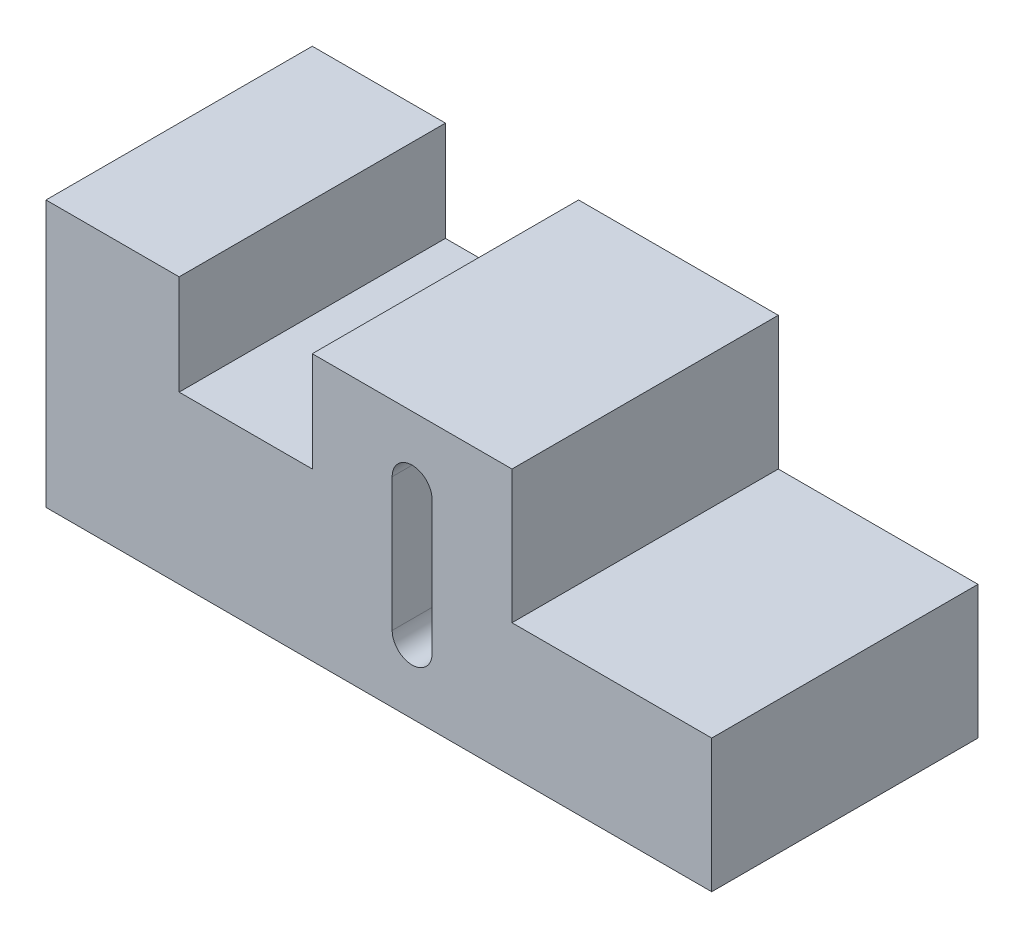
ISO-10303-21;
HEADER;
FILE_DESCRIPTION(('STEP AP214'),'2;1');
FILE_NAME('part.step','',(''),(''),'','','');
FILE_SCHEMA(('AUTOMOTIVE_DESIGN { 1 0 10303 214 1 1 1 1 }'));
ENDSEC;
DATA;
#1=APPLICATION_CONTEXT('core data for automotive mechanical design processes');
#2=APPLICATION_PROTOCOL_DEFINITION('international standard','automotive_design',2000,#1);
#3=PRODUCT_CONTEXT('',#1,'mechanical');
#4=PRODUCT('Part','Part','',(#3));
#5=PRODUCT_RELATED_PRODUCT_CATEGORY('part','',(#4));
#6=PRODUCT_DEFINITION_FORMATION('','',#4);
#7=PRODUCT_DEFINITION_CONTEXT('part definition',#1,'design');
#8=PRODUCT_DEFINITION('design','',#6,#7);
#9=PRODUCT_DEFINITION_SHAPE('','',#8);
#10=(LENGTH_UNIT() NAMED_UNIT(*) SI_UNIT(.MILLI.,.METRE.));
#11=(NAMED_UNIT(*) PLANE_ANGLE_UNIT() SI_UNIT($,.RADIAN.));
#12=(NAMED_UNIT(*) SI_UNIT($,.STERADIAN.) SOLID_ANGLE_UNIT());
#13=UNCERTAINTY_MEASURE_WITH_UNIT(LENGTH_MEASURE(1.E-05),#10,'distance_accuracy_value','');
#14=(GEOMETRIC_REPRESENTATION_CONTEXT(3) GLOBAL_UNCERTAINTY_ASSIGNED_CONTEXT((#13)) GLOBAL_UNIT_ASSIGNED_CONTEXT((#10,
#11,#12)) REPRESENTATION_CONTEXT('',''));
#15=CARTESIAN_POINT('',(0.,0.,0.));
#16=DIRECTION('',(0.,0.,1.));
#17=DIRECTION('',(1.,0.,0.));
#18=AXIS2_PLACEMENT_3D('',#15,#16,#17);
#19=CARTESIAN_POINT('',(12.7,15.875,-25.4));
#20=DIRECTION('',(1.,0.,0.));
#21=DIRECTION('',(0.,0.,-1.));
#22=AXIS2_PLACEMENT_3D('',#19,#20,#21);
#23=PLANE('',#22);
#24=DIRECTION('',(0.,1.,0.));
#25=VECTOR('',#24,1.);
#26=CARTESIAN_POINT('',(12.7,15.875,0.));
#27=LINE('',#26,#25);
#28=CARTESIAN_POINT('',(12.7,15.875,0.));
#29=VERTEX_POINT('',#28);
#30=CARTESIAN_POINT('',(12.7,25.4,0.));
#31=VERTEX_POINT('',#30);
#32=EDGE_CURVE('E165',#29,#31,#27,.T.);
#33=ORIENTED_EDGE('',*,*,#32,.F.);
#34=DIRECTION('',(0.,0.,1.));
#35=VECTOR('',#34,1.);
#36=CARTESIAN_POINT('',(12.7,15.875,-25.4));
#37=LINE('',#36,#35);
#38=CARTESIAN_POINT('',(12.7,15.875,-25.4));
#39=VERTEX_POINT('',#38);
#40=EDGE_CURVE('E11',#39,#29,#37,.T.);
#41=ORIENTED_EDGE('',*,*,#40,.F.);
#42=DIRECTION('',(0.,1.,0.));
#43=VECTOR('',#42,1.);
#44=CARTESIAN_POINT('',(12.7,15.875,-25.4));
#45=LINE('',#44,#43);
#46=CARTESIAN_POINT('',(12.7,25.4,-25.4));
#47=VERTEX_POINT('',#46);
#48=EDGE_CURVE('E169',#39,#47,#45,.T.);
#49=ORIENTED_EDGE('',*,*,#48,.T.);
#50=DIRECTION('',(0.,0.,1.));
#51=VECTOR('',#50,1.);
#52=CARTESIAN_POINT('',(12.7,25.4,-25.4));
#53=LINE('',#52,#51);
#54=EDGE_CURVE('E34',#47,#31,#53,.T.);
#55=ORIENTED_EDGE('',*,*,#54,.T.);
#56=EDGE_LOOP('',(#33,#41,#49,#55));
#57=FACE_BOUND('',#56,.T.);
#58=ADVANCED_FACE('F31',(#57),#23,.T.);
#59=CARTESIAN_POINT('',(25.4,15.875,-25.4));
#60=DIRECTION('',(0.,1.,0.));
#61=DIRECTION('',(-1.,0.,0.));
#62=AXIS2_PLACEMENT_3D('',#59,#60,#61);
#63=PLANE('',#62);
#64=DIRECTION('',(-1.,0.,0.));
#65=VECTOR('',#64,1.);
#66=CARTESIAN_POINT('',(25.4,15.875,0.));
#67=LINE('',#66,#65);
#68=CARTESIAN_POINT('',(25.4,15.875,0.));
#69=VERTEX_POINT('',#68);
#70=EDGE_CURVE('E173',#69,#29,#67,.T.);
#71=ORIENTED_EDGE('',*,*,#70,.F.);
#72=DIRECTION('',(0.,0.,1.));
#73=VECTOR('',#72,1.);
#74=CARTESIAN_POINT('',(25.4,15.875,-25.4));
#75=LINE('',#74,#73);
#76=CARTESIAN_POINT('',(25.4,15.875,-25.4));
#77=VERTEX_POINT('',#76);
#78=EDGE_CURVE('E39',#77,#69,#75,.T.);
#79=ORIENTED_EDGE('',*,*,#78,.F.);
#80=DIRECTION('',(-1.,0.,0.));
#81=VECTOR('',#80,1.);
#82=CARTESIAN_POINT('',(25.4,15.875,-25.4));
#83=LINE('',#82,#81);
#84=EDGE_CURVE('E197',#77,#39,#83,.T.);
#85=ORIENTED_EDGE('',*,*,#84,.T.);
#86=ORIENTED_EDGE('',*,*,#40,.T.);
#87=EDGE_LOOP('',(#71,#79,#85,#86));
#88=FACE_BOUND('',#87,.T.);
#89=ADVANCED_FACE('F254',(#88),#63,.T.);
#90=CARTESIAN_POINT('',(25.4,25.4,-25.4));
#91=DIRECTION('',(-1.,0.,0.));
#92=DIRECTION('',(0.,0.,1.));
#93=AXIS2_PLACEMENT_3D('',#90,#91,#92);
#94=PLANE('',#93);
#95=DIRECTION('',(0.,-1.,0.));
#96=VECTOR('',#95,1.);
#97=CARTESIAN_POINT('',(25.4,25.4,0.));
#98=LINE('',#97,#96);
#99=CARTESIAN_POINT('',(25.4,25.4,0.));
#100=VERTEX_POINT('',#99);
#101=EDGE_CURVE('E223',#100,#69,#98,.T.);
#102=ORIENTED_EDGE('',*,*,#101,.F.);
#103=DIRECTION('',(0.,0.,1.));
#104=VECTOR('',#103,1.);
#105=CARTESIAN_POINT('',(25.4,25.4,-25.4));
#106=LINE('',#105,#104);
#107=CARTESIAN_POINT('',(25.4,25.4,-25.4));
#108=VERTEX_POINT('',#107);
#109=EDGE_CURVE('E229',#108,#100,#106,.T.);
#110=ORIENTED_EDGE('',*,*,#109,.F.);
#111=DIRECTION('',(0.,-1.,0.));
#112=VECTOR('',#111,1.);
#113=CARTESIAN_POINT('',(25.4,25.4,-25.4));
#114=LINE('',#113,#112);
#115=EDGE_CURVE('E194',#108,#77,#114,.T.);
#116=ORIENTED_EDGE('',*,*,#115,.T.);
#117=ORIENTED_EDGE('',*,*,#78,.T.);
#118=EDGE_LOOP('',(#102,#110,#116,#117));
#119=FACE_BOUND('',#118,.T.);
#120=ADVANCED_FACE('F281',(#119),#94,.T.);
#121=CARTESIAN_POINT('',(44.45,25.4,-25.4));
#122=DIRECTION('',(0.,1.,0.));
#123=DIRECTION('',(-1.,0.,0.));
#124=AXIS2_PLACEMENT_3D('',#121,#122,#123);
#125=PLANE('',#124);
#126=DIRECTION('',(-1.,0.,0.));
#127=VECTOR('',#126,1.);
#128=CARTESIAN_POINT('',(44.45,25.4,0.));
#129=LINE('',#128,#127);
#130=CARTESIAN_POINT('',(44.45,25.4,0.));
#131=VERTEX_POINT('',#130);
#132=EDGE_CURVE('E220',#131,#100,#129,.T.);
#133=ORIENTED_EDGE('',*,*,#132,.F.);
#134=DIRECTION('',(0.,0.,1.));
#135=VECTOR('',#134,1.);
#136=CARTESIAN_POINT('',(44.45,25.4,-25.4));
#137=LINE('',#136,#135);
#138=CARTESIAN_POINT('',(44.45,25.4,-25.4));
#139=VERTEX_POINT('',#138);
#140=EDGE_CURVE('E231',#139,#131,#137,.T.);
#141=ORIENTED_EDGE('',*,*,#140,.F.);
#142=DIRECTION('',(-1.,0.,0.));
#143=VECTOR('',#142,1.);
#144=CARTESIAN_POINT('',(44.45,25.4,-25.4));
#145=LINE('',#144,#143);
#146=EDGE_CURVE('E191',#139,#108,#145,.T.);
#147=ORIENTED_EDGE('',*,*,#146,.T.);
#148=ORIENTED_EDGE('',*,*,#109,.T.);
#149=EDGE_LOOP('',(#133,#141,#147,#148));
#150=FACE_BOUND('',#149,.T.);
#151=ADVANCED_FACE('F279',(#150),#125,.T.);
#152=CARTESIAN_POINT('',(44.45,12.7,-25.4));
#153=DIRECTION('',(1.,0.,0.));
#154=DIRECTION('',(0.,1.,0.));
#155=AXIS2_PLACEMENT_3D('',#152,#153,#154);
#156=PLANE('',#155);
#157=DIRECTION('',(0.,1.,0.));
#158=VECTOR('',#157,1.);
#159=CARTESIAN_POINT('',(44.45,12.7,0.));
#160=LINE('',#159,#158);
#161=CARTESIAN_POINT('',(44.45,12.7,0.));
#162=VERTEX_POINT('',#161);
#163=EDGE_CURVE('E217',#162,#131,#160,.T.);
#164=ORIENTED_EDGE('',*,*,#163,.F.);
#165=DIRECTION('',(0.,0.,1.));
#166=VECTOR('',#165,1.);
#167=CARTESIAN_POINT('',(44.45,12.7,-25.4));
#168=LINE('',#167,#166);
#169=CARTESIAN_POINT('',(44.45,12.7,-25.4));
#170=VERTEX_POINT('',#169);
#171=EDGE_CURVE('E233',#170,#162,#168,.T.);
#172=ORIENTED_EDGE('',*,*,#171,.F.);
#173=DIRECTION('',(0.,1.,0.));
#174=VECTOR('',#173,1.);
#175=CARTESIAN_POINT('',(44.45,12.7,-25.4));
#176=LINE('',#175,#174);
#177=EDGE_CURVE('E188',#170,#139,#176,.T.);
#178=ORIENTED_EDGE('',*,*,#177,.T.);
#179=ORIENTED_EDGE('',*,*,#140,.T.);
#180=EDGE_LOOP('',(#164,#172,#178,#179));
#181=FACE_BOUND('',#180,.T.);
#182=ADVANCED_FACE('F275',(#181),#156,.T.);
#183=CARTESIAN_POINT('',(63.5,12.7,-25.4));
#184=DIRECTION('',(0.,1.,0.));
#185=DIRECTION('',(-1.,0.,0.));
#186=AXIS2_PLACEMENT_3D('',#183,#184,#185);
#187=PLANE('',#186);
#188=DIRECTION('',(-1.,0.,0.));
#189=VECTOR('',#188,1.);
#190=CARTESIAN_POINT('',(63.5,12.7,0.));
#191=LINE('',#190,#189);
#192=CARTESIAN_POINT('',(63.5,12.7,0.));
#193=VERTEX_POINT('',#192);
#194=EDGE_CURVE('E214',#193,#162,#191,.T.);
#195=ORIENTED_EDGE('',*,*,#194,.F.);
#196=DIRECTION('',(0.,0.,1.));
#197=VECTOR('',#196,1.);
#198=CARTESIAN_POINT('',(63.5,12.7,-25.4));
#199=LINE('',#198,#197);
#200=CARTESIAN_POINT('',(63.5,12.7,-25.4));
#201=VERTEX_POINT('',#200);
#202=EDGE_CURVE('E235',#201,#193,#199,.T.);
#203=ORIENTED_EDGE('',*,*,#202,.F.);
#204=DIRECTION('',(-1.,0.,0.));
#205=VECTOR('',#204,1.);
#206=CARTESIAN_POINT('',(63.5,12.7,-25.4));
#207=LINE('',#206,#205);
#208=EDGE_CURVE('E185',#201,#170,#207,.T.);
#209=ORIENTED_EDGE('',*,*,#208,.T.);
#210=ORIENTED_EDGE('',*,*,#171,.T.);
#211=EDGE_LOOP('',(#195,#203,#209,#210));
#212=FACE_BOUND('',#211,.T.);
#213=ADVANCED_FACE('F271',(#212),#187,.T.);
#214=CARTESIAN_POINT('',(63.5,0.,-25.4));
#215=DIRECTION('',(1.,0.,0.));
#216=DIRECTION('',(0.,1.,0.));
#217=AXIS2_PLACEMENT_3D('',#214,#215,#216);
#218=PLANE('',#217);
#219=DIRECTION('',(0.,1.,0.));
#220=VECTOR('',#219,1.);
#221=CARTESIAN_POINT('',(63.5,0.,0.));
#222=LINE('',#221,#220);
#223=CARTESIAN_POINT('',(63.5,0.,0.));
#224=VERTEX_POINT('',#223);
#225=EDGE_CURVE('E211',#224,#193,#222,.T.);
#226=ORIENTED_EDGE('',*,*,#225,.F.);
#227=DIRECTION('',(0.,0.,1.));
#228=VECTOR('',#227,1.);
#229=CARTESIAN_POINT('',(63.5,0.,-25.4));
#230=LINE('',#229,#228);
#231=CARTESIAN_POINT('',(63.5,0.,-25.4));
#232=VERTEX_POINT('',#231);
#233=EDGE_CURVE('E237',#232,#224,#230,.T.);
#234=ORIENTED_EDGE('',*,*,#233,.F.);
#235=DIRECTION('',(0.,1.,0.));
#236=VECTOR('',#235,1.);
#237=CARTESIAN_POINT('',(63.5,0.,-25.4));
#238=LINE('',#237,#236);
#239=EDGE_CURVE('E182',#232,#201,#238,.T.);
#240=ORIENTED_EDGE('',*,*,#239,.T.);
#241=ORIENTED_EDGE('',*,*,#202,.T.);
#242=EDGE_LOOP('',(#226,#234,#240,#241));
#243=FACE_BOUND('',#242,.T.);
#244=ADVANCED_FACE('F267',(#243),#218,.T.);
#245=CARTESIAN_POINT('',(0.,0.,-25.4));
#246=DIRECTION('',(0.,-1.,0.));
#247=DIRECTION('',(0.,0.,-1.));
#248=AXIS2_PLACEMENT_3D('',#245,#246,#247);
#249=PLANE('',#248);
#250=DIRECTION('',(1.,0.,0.));
#251=VECTOR('',#250,1.);
#252=CARTESIAN_POINT('',(0.,0.,0.));
#253=LINE('',#252,#251);
#254=CARTESIAN_POINT('',(0.,0.,0.));
#255=VERTEX_POINT('',#254);
#256=EDGE_CURVE('E208',#255,#224,#253,.T.);
#257=ORIENTED_EDGE('',*,*,#256,.F.);
#258=DIRECTION('',(0.,0.,1.));
#259=VECTOR('',#258,1.);
#260=CARTESIAN_POINT('',(0.,0.,-25.4));
#261=LINE('',#260,#259);
#262=CARTESIAN_POINT('',(0.,0.,-25.4));
#263=VERTEX_POINT('',#262);
#264=EDGE_CURVE('E239',#263,#255,#261,.T.);
#265=ORIENTED_EDGE('',*,*,#264,.F.);
#266=DIRECTION('',(1.,0.,0.));
#267=VECTOR('',#266,1.);
#268=CARTESIAN_POINT('',(0.,0.,-25.4));
#269=LINE('',#268,#267);
#270=EDGE_CURVE('E179',#263,#232,#269,.T.);
#271=ORIENTED_EDGE('',*,*,#270,.T.);
#272=ORIENTED_EDGE('',*,*,#233,.T.);
#273=EDGE_LOOP('',(#257,#265,#271,#272));
#274=FACE_BOUND('',#273,.T.);
#275=ADVANCED_FACE('F265',(#274),#249,.T.);
#276=CARTESIAN_POINT('',(0.,25.4,-25.4));
#277=DIRECTION('',(-1.,0.,0.));
#278=DIRECTION('',(0.,-1.,0.));
#279=AXIS2_PLACEMENT_3D('',#276,#277,#278);
#280=PLANE('',#279);
#281=DIRECTION('',(0.,-1.,0.));
#282=VECTOR('',#281,1.);
#283=CARTESIAN_POINT('',(0.,25.4,0.));
#284=LINE('',#283,#282);
#285=CARTESIAN_POINT('',(0.,25.4,0.));
#286=VERTEX_POINT('',#285);
#287=EDGE_CURVE('E205',#286,#255,#284,.T.);
#288=ORIENTED_EDGE('',*,*,#287,.F.);
#289=DIRECTION('',(0.,0.,1.));
#290=VECTOR('',#289,1.);
#291=CARTESIAN_POINT('',(0.,25.4,-25.4));
#292=LINE('',#291,#290);
#293=CARTESIAN_POINT('',(0.,25.4,-25.4));
#294=VERTEX_POINT('',#293);
#295=EDGE_CURVE('E240',#294,#286,#292,.T.);
#296=ORIENTED_EDGE('',*,*,#295,.F.);
#297=DIRECTION('',(0.,-1.,0.));
#298=VECTOR('',#297,1.);
#299=CARTESIAN_POINT('',(0.,25.4,-25.4));
#300=LINE('',#299,#298);
#301=EDGE_CURVE('E176',#294,#263,#300,.T.);
#302=ORIENTED_EDGE('',*,*,#301,.T.);
#303=ORIENTED_EDGE('',*,*,#264,.T.);
#304=EDGE_LOOP('',(#288,#296,#302,#303));
#305=FACE_BOUND('',#304,.T.);
#306=ADVANCED_FACE('F261',(#305),#280,.T.);
#307=CARTESIAN_POINT('',(12.7,25.4,-25.4));
#308=DIRECTION('',(0.,1.,0.));
#309=DIRECTION('',(0.,0.,1.));
#310=AXIS2_PLACEMENT_3D('',#307,#308,#309);
#311=PLANE('',#310);
#312=DIRECTION('',(-1.,0.,0.));
#313=VECTOR('',#312,1.);
#314=CARTESIAN_POINT('',(12.7,25.4,0.));
#315=LINE('',#314,#313);
#316=EDGE_CURVE('E202',#31,#286,#315,.T.);
#317=ORIENTED_EDGE('',*,*,#316,.F.);
#318=ORIENTED_EDGE('',*,*,#54,.F.);
#319=DIRECTION('',(-1.,0.,0.));
#320=VECTOR('',#319,1.);
#321=CARTESIAN_POINT('',(12.7,25.4,-25.4));
#322=LINE('',#321,#320);
#323=EDGE_CURVE('E172',#47,#294,#322,.T.);
#324=ORIENTED_EDGE('',*,*,#323,.T.);
#325=ORIENTED_EDGE('',*,*,#295,.T.);
#326=EDGE_LOOP('',(#317,#318,#324,#325));
#327=FACE_BOUND('',#326,.T.);
#328=ADVANCED_FACE('F248',(#327),#311,.T.);
#329=CARTESIAN_POINT('',(12.7,25.4,-25.4));
#330=DIRECTION('',(0.,0.,1.));
#331=DIRECTION('',(1.,0.,0.));
#332=AXIS2_PLACEMENT_3D('',#329,#330,#331);
#333=PLANE('',#332);
#334=DIRECTION('',(0.,1.,0.));
#335=VECTOR('',#334,1.);
#336=CARTESIAN_POINT('',(36.83,19.05,-25.4));
#337=LINE('',#336,#335);
#338=CARTESIAN_POINT('',(36.83,6.35000000000001,-25.4));
#339=VERTEX_POINT('',#338);
#340=CARTESIAN_POINT('',(36.83,19.05,-25.4));
#341=VERTEX_POINT('',#340);
#342=EDGE_CURVE('E140',#339,#341,#337,.T.);
#343=ORIENTED_EDGE('',*,*,#342,.T.);
#344=CARTESIAN_POINT('',(34.925,19.05,-25.4));
#345=DIRECTION('',(0.,0.,1.));
#346=DIRECTION('',(1.,0.,0.));
#347=AXIS2_PLACEMENT_3D('',#344,#345,#346);
#348=CIRCLE('',#347,1.905);
#349=CARTESIAN_POINT('',(33.02,19.05,-25.4));
#350=VERTEX_POINT('',#349);
#351=EDGE_CURVE('E134',#341,#350,#348,.T.);
#352=ORIENTED_EDGE('',*,*,#351,.T.);
#353=DIRECTION('',(0.,-1.,0.));
#354=VECTOR('',#353,1.);
#355=CARTESIAN_POINT('',(33.02,19.05,-25.4));
#356=LINE('',#355,#354);
#357=CARTESIAN_POINT('',(33.02,6.35000000000001,-25.4));
#358=VERTEX_POINT('',#357);
#359=EDGE_CURVE('E143',#350,#358,#356,.T.);
#360=ORIENTED_EDGE('',*,*,#359,.T.);
#361=CARTESIAN_POINT('',(34.925,6.35000000000001,-25.4));
#362=DIRECTION('',(0.,0.,1.));
#363=DIRECTION('',(1.,0.,0.));
#364=AXIS2_PLACEMENT_3D('',#361,#362,#363);
#365=CIRCLE('',#364,1.905);
#366=EDGE_CURVE('E47',#358,#339,#365,.T.);
#367=ORIENTED_EDGE('',*,*,#366,.T.);
#368=EDGE_LOOP('',(#343,#352,#360,#367));
#369=FACE_BOUND('',#368,.T.);
#370=ORIENTED_EDGE('',*,*,#48,.F.);
#371=ORIENTED_EDGE('',*,*,#84,.F.);
#372=ORIENTED_EDGE('',*,*,#115,.F.);
#373=ORIENTED_EDGE('',*,*,#146,.F.);
#374=ORIENTED_EDGE('',*,*,#177,.F.);
#375=ORIENTED_EDGE('',*,*,#208,.F.);
#376=ORIENTED_EDGE('',*,*,#239,.F.);
#377=ORIENTED_EDGE('',*,*,#270,.F.);
#378=ORIENTED_EDGE('',*,*,#301,.F.);
#379=ORIENTED_EDGE('',*,*,#323,.F.);
#380=EDGE_LOOP('',(#370,#371,#372,#373,#374,#375,#376,#377,#378,#379));
#381=FACE_BOUND('',#380,.T.);
#382=ADVANCED_FACE('F147',(#369,#381),#333,.F.);
#383=CARTESIAN_POINT('',(12.7,25.4,0.));
#384=DIRECTION('',(0.,0.,1.));
#385=DIRECTION('',(1.,0.,0.));
#386=AXIS2_PLACEMENT_3D('',#383,#384,#385);
#387=PLANE('',#386);
#388=CARTESIAN_POINT('',(34.925,19.05,0.));
#389=DIRECTION('',(0.,0.,1.));
#390=DIRECTION('',(1.,0.,0.));
#391=AXIS2_PLACEMENT_3D('',#388,#389,#390);
#392=CIRCLE('',#391,1.905);
#393=CARTESIAN_POINT('',(36.83,19.05,0.));
#394=VERTEX_POINT('',#393);
#395=CARTESIAN_POINT('',(33.02,19.05,0.));
#396=VERTEX_POINT('',#395);
#397=EDGE_CURVE('E55',#394,#396,#392,.T.);
#398=ORIENTED_EDGE('',*,*,#397,.F.);
#399=DIRECTION('',(0.,1.,0.));
#400=VECTOR('',#399,1.);
#401=CARTESIAN_POINT('',(36.83,19.05,0.));
#402=LINE('',#401,#400);
#403=CARTESIAN_POINT('',(36.83,6.35000000000001,0.));
#404=VERTEX_POINT('',#403);
#405=EDGE_CURVE('E150',#404,#394,#402,.T.);
#406=ORIENTED_EDGE('',*,*,#405,.F.);
#407=CARTESIAN_POINT('',(34.925,6.35000000000001,0.));
#408=DIRECTION('',(0.,0.,1.));
#409=DIRECTION('',(1.,0.,0.));
#410=AXIS2_PLACEMENT_3D('',#407,#408,#409);
#411=CIRCLE('',#410,1.905);
#412=CARTESIAN_POINT('',(33.02,6.35000000000001,0.));
#413=VERTEX_POINT('',#412);
#414=EDGE_CURVE('E153',#413,#404,#411,.T.);
#415=ORIENTED_EDGE('',*,*,#414,.F.);
#416=DIRECTION('',(0.,-1.,0.));
#417=VECTOR('',#416,1.);
#418=CARTESIAN_POINT('',(33.02,19.05,0.));
#419=LINE('',#418,#417);
#420=EDGE_CURVE('E159',#396,#413,#419,.T.);
#421=ORIENTED_EDGE('',*,*,#420,.F.);
#422=EDGE_LOOP('',(#398,#406,#415,#421));
#423=FACE_BOUND('',#422,.T.);
#424=ORIENTED_EDGE('',*,*,#32,.T.);
#425=ORIENTED_EDGE('',*,*,#316,.T.);
#426=ORIENTED_EDGE('',*,*,#287,.T.);
#427=ORIENTED_EDGE('',*,*,#256,.T.);
#428=ORIENTED_EDGE('',*,*,#225,.T.);
#429=ORIENTED_EDGE('',*,*,#194,.T.);
#430=ORIENTED_EDGE('',*,*,#163,.T.);
#431=ORIENTED_EDGE('',*,*,#132,.T.);
#432=ORIENTED_EDGE('',*,*,#101,.T.);
#433=ORIENTED_EDGE('',*,*,#70,.T.);
#434=EDGE_LOOP('',(#424,#425,#426,#427,#428,#429,#430,#431,#432,#433));
#435=FACE_BOUND('',#434,.T.);
#436=ADVANCED_FACE('F250',(#423,#435),#387,.T.);
#437=CARTESIAN_POINT('',(34.925,19.05,-25.4));
#438=DIRECTION('',(0.,0.,1.));
#439=DIRECTION('',(1.,0.,0.));
#440=AXIS2_PLACEMENT_3D('',#437,#438,#439);
#441=CYLINDRICAL_SURFACE('',#440,1.905);
#442=ORIENTED_EDGE('',*,*,#397,.T.);
#443=DIRECTION('',(0.,0.,1.));
#444=VECTOR('',#443,1.);
#445=CARTESIAN_POINT('',(33.02,19.05,-25.4));
#446=LINE('',#445,#444);
#447=EDGE_CURVE('E130',#350,#396,#446,.T.);
#448=ORIENTED_EDGE('',*,*,#447,.F.);
#449=ORIENTED_EDGE('',*,*,#351,.F.);
#450=DIRECTION('',(0.,0.,1.));
#451=VECTOR('',#450,1.);
#452=CARTESIAN_POINT('',(36.83,19.05,-25.4));
#453=LINE('',#452,#451);
#454=EDGE_CURVE('E163',#341,#394,#453,.T.);
#455=ORIENTED_EDGE('',*,*,#454,.T.);
#456=EDGE_LOOP('',(#442,#448,#449,#455));
#457=FACE_BOUND('',#456,.T.);
#458=ADVANCED_FACE('F132',(#457),#441,.F.);
#459=CARTESIAN_POINT('',(36.83,19.05,-25.4));
#460=DIRECTION('',(1.,0.,0.));
#461=DIRECTION('',(0.,1.,0.));
#462=AXIS2_PLACEMENT_3D('',#459,#460,#461);
#463=PLANE('',#462);
#464=ORIENTED_EDGE('',*,*,#405,.T.);
#465=ORIENTED_EDGE('',*,*,#454,.F.);
#466=ORIENTED_EDGE('',*,*,#342,.F.);
#467=DIRECTION('',(0.,0.,1.));
#468=VECTOR('',#467,1.);
#469=CARTESIAN_POINT('',(36.83,6.35000000000001,-25.4));
#470=LINE('',#469,#468);
#471=EDGE_CURVE('E166',#339,#404,#470,.T.);
#472=ORIENTED_EDGE('',*,*,#471,.T.);
#473=EDGE_LOOP('',(#464,#465,#466,#472));
#474=FACE_BOUND('',#473,.T.);
#475=ADVANCED_FACE('F380',(#474),#463,.F.);
#476=CARTESIAN_POINT('',(34.925,6.35000000000001,-25.4));
#477=DIRECTION('',(0.,0.,1.));
#478=DIRECTION('',(1.,0.,0.));
#479=AXIS2_PLACEMENT_3D('',#476,#477,#478);
#480=CYLINDRICAL_SURFACE('',#479,1.905);
#481=ORIENTED_EDGE('',*,*,#414,.T.);
#482=ORIENTED_EDGE('',*,*,#471,.F.);
#483=ORIENTED_EDGE('',*,*,#366,.F.);
#484=DIRECTION('',(0.,0.,1.));
#485=VECTOR('',#484,1.);
#486=CARTESIAN_POINT('',(33.02,6.35000000000001,-25.4));
#487=LINE('',#486,#485);
#488=EDGE_CURVE('E139',#358,#413,#487,.T.);
#489=ORIENTED_EDGE('',*,*,#488,.T.);
#490=EDGE_LOOP('',(#481,#482,#483,#489));
#491=FACE_BOUND('',#490,.T.);
#492=ADVANCED_FACE('F389',(#491),#480,.F.);
#493=CARTESIAN_POINT('',(33.02,19.05,-25.4));
#494=DIRECTION('',(-1.,0.,0.));
#495=DIRECTION('',(0.,-1.,0.));
#496=AXIS2_PLACEMENT_3D('',#493,#494,#495);
#497=PLANE('',#496);
#498=ORIENTED_EDGE('',*,*,#420,.T.);
#499=ORIENTED_EDGE('',*,*,#488,.F.);
#500=ORIENTED_EDGE('',*,*,#359,.F.);
#501=ORIENTED_EDGE('',*,*,#447,.T.);
#502=EDGE_LOOP('',(#498,#499,#500,#501));
#503=FACE_BOUND('',#502,.T.);
#504=ADVANCED_FACE('F144',(#503),#497,.F.);
#505=CLOSED_SHELL('',(#58,#89,#120,#151,#182,#213,#244,#275,#306,#328,#382,#436,#458,#475,#492,#504));
#506=MANIFOLD_SOLID_BREP('B2',#505);
#507=ADVANCED_BREP_SHAPE_REPRESENTATION('',(#18,#506),#14);
#508=SHAPE_DEFINITION_REPRESENTATION(#9,#507);
ENDSEC;
END-ISO-10303-21;
